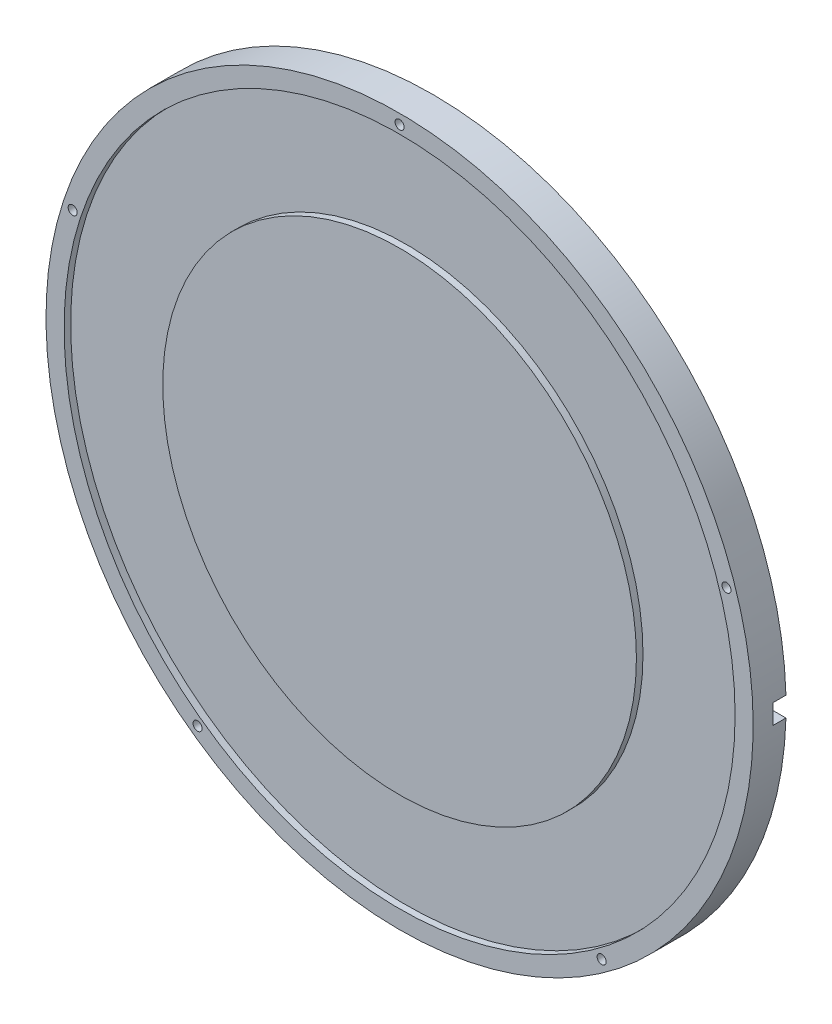
ISO-10303-21;
HEADER;
FILE_DESCRIPTION(('STEP AP214'),'2;1');
FILE_NAME('part.step','',(''),(''),'','','');
FILE_SCHEMA(('AUTOMOTIVE_DESIGN { 1 0 10303 214 1 1 1 1 }'));
ENDSEC;
DATA;
#1=APPLICATION_CONTEXT('core data for automotive mechanical design processes');
#2=APPLICATION_PROTOCOL_DEFINITION('international standard','automotive_design',2000,#1);
#3=PRODUCT_CONTEXT('',#1,'mechanical');
#4=PRODUCT('Part','Part','',(#3));
#5=PRODUCT_RELATED_PRODUCT_CATEGORY('part','',(#4));
#6=PRODUCT_DEFINITION_FORMATION('','',#4);
#7=PRODUCT_DEFINITION_CONTEXT('part definition',#1,'design');
#8=PRODUCT_DEFINITION('design','',#6,#7);
#9=PRODUCT_DEFINITION_SHAPE('','',#8);
#10=(LENGTH_UNIT() NAMED_UNIT(*) SI_UNIT(.MILLI.,.METRE.));
#11=(NAMED_UNIT(*) PLANE_ANGLE_UNIT() SI_UNIT($,.RADIAN.));
#12=(NAMED_UNIT(*) SI_UNIT($,.STERADIAN.) SOLID_ANGLE_UNIT());
#13=UNCERTAINTY_MEASURE_WITH_UNIT(LENGTH_MEASURE(1.E-05),#10,'distance_accuracy_value','');
#14=(GEOMETRIC_REPRESENTATION_CONTEXT(3) GLOBAL_UNCERTAINTY_ASSIGNED_CONTEXT((#13)) GLOBAL_UNIT_ASSIGNED_CONTEXT((#10,
#11,#12)) REPRESENTATION_CONTEXT('',''));
#15=CARTESIAN_POINT('',(0.,0.,0.));
#16=DIRECTION('',(0.,0.,1.));
#17=DIRECTION('',(1.,0.,0.));
#18=AXIS2_PLACEMENT_3D('',#15,#16,#17);
#19=CARTESIAN_POINT('',(0.,0.,0.));
#20=DIRECTION('',(0.,0.,1.));
#21=DIRECTION('',(1.,0.,0.));
#22=AXIS2_PLACEMENT_3D('',#19,#20,#21);
#23=PLANE('',#22);
#24=CARTESIAN_POINT('',(198.770811905687,64.584551824364,0.));
#25=DIRECTION('',(0.,0.,1.));
#26=DIRECTION('',(1.,0.,0.));
#27=AXIS2_PLACEMENT_3D('',#24,#25,#26);
#28=CIRCLE('',#27,5.);
#29=CARTESIAN_POINT('',(203.770811905687,64.584551824364,0.));
#30=VERTEX_POINT('',#29);
#31=EDGE_CURVE('E510',#30,#30,#28,.T.);
#32=ORIENTED_EDGE('',*,*,#31,.T.);
#33=EDGE_LOOP('',(#32));
#34=FACE_BOUND('',#33,.T.);
#35=CARTESIAN_POINT('',(0.,209.,0.));
#36=DIRECTION('',(0.,0.,1.));
#37=DIRECTION('',(1.,0.,0.));
#38=AXIS2_PLACEMENT_3D('',#35,#36,#37);
#39=CIRCLE('',#38,5.);
#40=CARTESIAN_POINT('',(5.00000000000001,209.,0.));
#41=VERTEX_POINT('',#40);
#42=EDGE_CURVE('E512',#41,#41,#39,.T.);
#43=ORIENTED_EDGE('',*,*,#42,.T.);
#44=EDGE_LOOP('',(#43));
#45=FACE_BOUND('',#44,.T.);
#46=CARTESIAN_POINT('',(-198.770811905687,64.584551824364,0.));
#47=DIRECTION('',(0.,0.,1.));
#48=DIRECTION('',(1.,0.,0.));
#49=AXIS2_PLACEMENT_3D('',#46,#47,#48);
#50=CIRCLE('',#49,5.);
#51=CARTESIAN_POINT('',(-193.770811905687,64.584551824364,0.));
#52=VERTEX_POINT('',#51);
#53=EDGE_CURVE('E518',#52,#52,#50,.T.);
#54=ORIENTED_EDGE('',*,*,#53,.T.);
#55=EDGE_LOOP('',(#54));
#56=FACE_BOUND('',#55,.T.);
#57=CARTESIAN_POINT('',(-122.847117729127,-169.084551824364,0.));
#58=DIRECTION('',(0.,0.,1.));
#59=DIRECTION('',(1.,0.,0.));
#60=AXIS2_PLACEMENT_3D('',#57,#58,#59);
#61=CIRCLE('',#60,5.);
#62=CARTESIAN_POINT('',(-117.847117729127,-169.084551824364,0.));
#63=VERTEX_POINT('',#62);
#64=EDGE_CURVE('E524',#63,#63,#61,.T.);
#65=ORIENTED_EDGE('',*,*,#64,.T.);
#66=EDGE_LOOP('',(#65));
#67=FACE_BOUND('',#66,.T.);
#68=CARTESIAN_POINT('',(122.847117729127,-169.084551824364,0.));
#69=DIRECTION('',(0.,0.,1.));
#70=DIRECTION('',(1.,0.,0.));
#71=AXIS2_PLACEMENT_3D('',#68,#69,#70);
#72=CIRCLE('',#71,4.99999999999999);
#73=CARTESIAN_POINT('',(127.847117729127,-169.084551824364,0.));
#74=VERTEX_POINT('',#73);
#75=EDGE_CURVE('E530',#74,#74,#72,.T.);
#76=ORIENTED_EDGE('',*,*,#75,.T.);
#77=EDGE_LOOP('',(#76));
#78=FACE_BOUND('',#77,.T.);
#79=DIRECTION('',(1.,0.,0.));
#80=VECTOR('',#79,1.);
#81=CARTESIAN_POINT('',(160.,-6.,0.));
#82=LINE('',#81,#80);
#83=CARTESIAN_POINT('',(165.,-6.,0.));
#84=VERTEX_POINT('',#83);
#85=CARTESIAN_POINT('',(214.916262762965,-6.,0.));
#86=VERTEX_POINT('',#85);
#87=EDGE_CURVE('E118',#84,#86,#82,.T.);
#88=ORIENTED_EDGE('',*,*,#87,.T.);
#89=CARTESIAN_POINT('',(0.,0.,0.));
#90=DIRECTION('',(0.,0.,1.));
#91=DIRECTION('',(1.,0.,0.));
#92=AXIS2_PLACEMENT_3D('',#89,#90,#91);
#93=CIRCLE('',#92,215.);
#94=CARTESIAN_POINT('',(214.916262762965,6.,0.));
#95=VERTEX_POINT('',#94);
#96=EDGE_CURVE('E48',#95,#86,#93,.T.);
#97=ORIENTED_EDGE('',*,*,#96,.F.);
#98=DIRECTION('',(-1.,0.,0.));
#99=VECTOR('',#98,1.);
#100=CARTESIAN_POINT('',(160.,6.,0.));
#101=LINE('',#100,#99);
#102=CARTESIAN_POINT('',(165.,6.,0.));
#103=VERTEX_POINT('',#102);
#104=EDGE_CURVE('E108',#95,#103,#101,.T.);
#105=ORIENTED_EDGE('',*,*,#104,.T.);
#106=DIRECTION('',(0.,1.,0.));
#107=VECTOR('',#106,1.);
#108=CARTESIAN_POINT('',(165.,-15.,0.));
#109=LINE('',#108,#107);
#110=CARTESIAN_POINT('',(165.,15.,0.));
#111=VERTEX_POINT('',#110);
#112=EDGE_CURVE('E494',#103,#111,#109,.T.);
#113=ORIENTED_EDGE('',*,*,#112,.T.);
#114=DIRECTION('',(-1.,0.,0.));
#115=VECTOR('',#114,1.);
#116=CARTESIAN_POINT('',(125.,15.,0.));
#117=LINE('',#116,#115);
#118=CARTESIAN_POINT('',(125.,15.,0.));
#119=VERTEX_POINT('',#118);
#120=EDGE_CURVE('E481',#111,#119,#117,.T.);
#121=ORIENTED_EDGE('',*,*,#120,.T.);
#122=DIRECTION('',(0.,-1.,0.));
#123=VECTOR('',#122,1.);
#124=CARTESIAN_POINT('',(125.,-15.,0.));
#125=LINE('',#124,#123);
#126=CARTESIAN_POINT('',(125.,-15.,0.));
#127=VERTEX_POINT('',#126);
#128=EDGE_CURVE('E64',#119,#127,#125,.T.);
#129=ORIENTED_EDGE('',*,*,#128,.T.);
#130=DIRECTION('',(1.,0.,0.));
#131=VECTOR('',#130,1.);
#132=CARTESIAN_POINT('',(125.,-15.,0.));
#133=LINE('',#132,#131);
#134=CARTESIAN_POINT('',(165.,-15.,0.));
#135=VERTEX_POINT('',#134);
#136=EDGE_CURVE('E491',#127,#135,#133,.T.);
#137=ORIENTED_EDGE('',*,*,#136,.T.);
#138=EDGE_CURVE('E495',#135,#84,#109,.T.);
#139=ORIENTED_EDGE('',*,*,#138,.T.);
#140=EDGE_LOOP('',(#88,#97,#105,#113,#121,#129,#137,#139));
#141=FACE_BOUND('',#140,.T.);
#142=ADVANCED_FACE('F39',(#34,#45,#56,#67,#78,#141),#23,.F.);
#143=CARTESIAN_POINT('',(0.,0.,20.));
#144=DIRECTION('',(0.,0.,-1.));
#145=DIRECTION('',(-1.,0.,0.));
#146=AXIS2_PLACEMENT_3D('',#143,#144,#145);
#147=CYLINDRICAL_SURFACE('',#146,215.);
#148=CARTESIAN_POINT('',(0.,0.,20.));
#149=DIRECTION('',(0.,0.,1.));
#150=DIRECTION('',(1.,0.,0.));
#151=AXIS2_PLACEMENT_3D('',#148,#149,#150);
#152=CIRCLE('',#151,215.);
#153=CARTESIAN_POINT('',(215.,0.,20.));
#154=VERTEX_POINT('',#153);
#155=EDGE_CURVE('E11',#154,#154,#152,.T.);
#156=ORIENTED_EDGE('',*,*,#155,.F.);
#157=EDGE_LOOP('',(#156));
#158=FACE_BOUND('',#157,.T.);
#159=DIRECTION('',(0.,0.,-1.));
#160=VECTOR('',#159,1.);
#161=CARTESIAN_POINT('',(214.916262762965,-6.,20.));
#162=LINE('',#161,#160);
#163=CARTESIAN_POINT('',(214.916262762965,-6.,8.));
#164=VERTEX_POINT('',#163);
#165=EDGE_CURVE('E471',#164,#86,#162,.T.);
#166=ORIENTED_EDGE('',*,*,#165,.F.);
#167=CARTESIAN_POINT('',(0.,0.,8.));
#168=DIRECTION('',(0.,0.,-1.));
#169=DIRECTION('',(-1.,0.,0.));
#170=AXIS2_PLACEMENT_3D('',#167,#168,#169);
#171=CIRCLE('',#170,215.);
#172=CARTESIAN_POINT('',(214.916262762965,6.,8.));
#173=VERTEX_POINT('',#172);
#174=EDGE_CURVE('E124',#173,#164,#171,.T.);
#175=ORIENTED_EDGE('',*,*,#174,.F.);
#176=DIRECTION('',(0.,0.,-1.));
#177=VECTOR('',#176,1.);
#178=CARTESIAN_POINT('',(214.916262762965,6.,20.));
#179=LINE('',#178,#177);
#180=EDGE_CURVE('E111',#95,#173,#179,.F.);
#181=ORIENTED_EDGE('',*,*,#180,.F.);
#182=ORIENTED_EDGE('',*,*,#96,.T.);
#183=EDGE_LOOP('',(#166,#175,#181,#182));
#184=FACE_BOUND('',#183,.T.);
#185=ADVANCED_FACE('F41',(#158,#184),#147,.T.);
#186=CARTESIAN_POINT('',(165.,-15.,8.));
#187=DIRECTION('',(-1.,0.,0.));
#188=DIRECTION('',(0.,0.,1.));
#189=AXIS2_PLACEMENT_3D('',#186,#187,#188);
#190=PLANE('',#189);
#191=DIRECTION('',(0.,1.,0.));
#192=VECTOR('',#191,1.);
#193=CARTESIAN_POINT('',(165.,-15.,8.));
#194=LINE('',#193,#192);
#195=CARTESIAN_POINT('',(165.,-15.,8.));
#196=VERTEX_POINT('',#195);
#197=CARTESIAN_POINT('',(165.,-6.,8.));
#198=VERTEX_POINT('',#197);
#199=EDGE_CURVE('E484',#196,#198,#194,.T.);
#200=ORIENTED_EDGE('',*,*,#199,.T.);
#201=DIRECTION('',(0.,0.,-1.));
#202=VECTOR('',#201,1.);
#203=CARTESIAN_POINT('',(165.,-6.,8.));
#204=LINE('',#203,#202);
#205=EDGE_CURVE('E125',#198,#84,#204,.T.);
#206=ORIENTED_EDGE('',*,*,#205,.T.);
#207=ORIENTED_EDGE('',*,*,#138,.F.);
#208=DIRECTION('',(0.,0.,-1.));
#209=VECTOR('',#208,1.);
#210=CARTESIAN_POINT('',(165.,-15.,8.));
#211=LINE('',#210,#209);
#212=EDGE_CURVE('E503',#196,#135,#211,.T.);
#213=ORIENTED_EDGE('',*,*,#212,.F.);
#214=EDGE_LOOP('',(#200,#206,#207,#213));
#215=FACE_BOUND('',#214,.T.);
#216=ADVANCED_FACE('F196',(#215),#190,.T.);
#217=ORIENTED_EDGE('',*,*,#112,.F.);
#218=DIRECTION('',(0.,0.,1.));
#219=VECTOR('',#218,1.);
#220=CARTESIAN_POINT('',(165.,6.,8.));
#221=LINE('',#220,#219);
#222=CARTESIAN_POINT('',(165.,6.,8.));
#223=VERTEX_POINT('',#222);
#224=EDGE_CURVE('E114',#103,#223,#221,.T.);
#225=ORIENTED_EDGE('',*,*,#224,.T.);
#226=CARTESIAN_POINT('',(165.,15.,8.));
#227=VERTEX_POINT('',#226);
#228=EDGE_CURVE('E483',#223,#227,#194,.T.);
#229=ORIENTED_EDGE('',*,*,#228,.T.);
#230=DIRECTION('',(0.,0.,-1.));
#231=VECTOR('',#230,1.);
#232=CARTESIAN_POINT('',(165.,15.,8.));
#233=LINE('',#232,#231);
#234=EDGE_CURVE('E500',#227,#111,#233,.T.);
#235=ORIENTED_EDGE('',*,*,#234,.T.);
#236=EDGE_LOOP('',(#217,#225,#229,#235));
#237=FACE_BOUND('',#236,.T.);
#238=ADVANCED_FACE('F201',(#237),#190,.T.);
#239=CARTESIAN_POINT('',(0.,0.,20.));
#240=DIRECTION('',(0.,0.,1.));
#241=DIRECTION('',(1.,0.,0.));
#242=AXIS2_PLACEMENT_3D('',#239,#240,#241);
#243=PLANE('',#242);
#244=CARTESIAN_POINT('',(198.770811905687,64.584551824364,20.));
#245=DIRECTION('',(0.,0.,1.));
#246=DIRECTION('',(1.,0.,0.));
#247=AXIS2_PLACEMENT_3D('',#244,#245,#246);
#248=CIRCLE('',#247,2.75);
#249=CARTESIAN_POINT('',(201.520811905687,64.584551824364,20.));
#250=VERTEX_POINT('',#249);
#251=EDGE_CURVE('E168',#250,#250,#248,.T.);
#252=ORIENTED_EDGE('',*,*,#251,.F.);
#253=EDGE_LOOP('',(#252));
#254=FACE_BOUND('',#253,.T.);
#255=CARTESIAN_POINT('',(0.,209.,20.));
#256=DIRECTION('',(0.,0.,1.));
#257=DIRECTION('',(1.,0.,0.));
#258=AXIS2_PLACEMENT_3D('',#255,#256,#257);
#259=CIRCLE('',#258,2.75);
#260=CARTESIAN_POINT('',(2.75000000000001,209.,20.));
#261=VERTEX_POINT('',#260);
#262=EDGE_CURVE('E537',#261,#261,#259,.T.);
#263=ORIENTED_EDGE('',*,*,#262,.F.);
#264=EDGE_LOOP('',(#263));
#265=FACE_BOUND('',#264,.T.);
#266=CARTESIAN_POINT('',(-198.770811905687,64.584551824364,20.));
#267=DIRECTION('',(0.,0.,1.));
#268=DIRECTION('',(1.,0.,0.));
#269=AXIS2_PLACEMENT_3D('',#266,#267,#268);
#270=CIRCLE('',#269,2.75);
#271=CARTESIAN_POINT('',(-196.020811905687,64.584551824364,20.));
#272=VERTEX_POINT('',#271);
#273=EDGE_CURVE('E159',#272,#272,#270,.T.);
#274=ORIENTED_EDGE('',*,*,#273,.F.);
#275=EDGE_LOOP('',(#274));
#276=FACE_BOUND('',#275,.T.);
#277=CARTESIAN_POINT('',(-122.847117729127,-169.084551824364,20.));
#278=DIRECTION('',(0.,0.,1.));
#279=DIRECTION('',(1.,0.,0.));
#280=AXIS2_PLACEMENT_3D('',#277,#278,#279);
#281=CIRCLE('',#280,2.75);
#282=CARTESIAN_POINT('',(-120.097117729127,-169.084551824364,20.));
#283=VERTEX_POINT('',#282);
#284=EDGE_CURVE('E154',#283,#283,#281,.T.);
#285=ORIENTED_EDGE('',*,*,#284,.F.);
#286=EDGE_LOOP('',(#285));
#287=FACE_BOUND('',#286,.T.);
#288=CARTESIAN_POINT('',(122.847117729127,-169.084551824364,20.));
#289=DIRECTION('',(0.,0.,1.));
#290=DIRECTION('',(1.,0.,0.));
#291=AXIS2_PLACEMENT_3D('',#288,#289,#290);
#292=CIRCLE('',#291,2.74999999999999);
#293=CARTESIAN_POINT('',(125.597117729127,-169.084551824364,20.));
#294=VERTEX_POINT('',#293);
#295=EDGE_CURVE('E150',#294,#294,#292,.T.);
#296=ORIENTED_EDGE('',*,*,#295,.F.);
#297=EDGE_LOOP('',(#296));
#298=FACE_BOUND('',#297,.T.);
#299=CARTESIAN_POINT('',(0.,0.,20.));
#300=DIRECTION('',(0.,0.,1.));
#301=DIRECTION('',(1.,0.,0.));
#302=AXIS2_PLACEMENT_3D('',#299,#300,#301);
#303=CIRCLE('',#302,204.);
#304=CARTESIAN_POINT('',(204.,0.,20.));
#305=VERTEX_POINT('',#304);
#306=EDGE_CURVE('E129',#305,#305,#303,.T.);
#307=ORIENTED_EDGE('',*,*,#306,.F.);
#308=EDGE_LOOP('',(#307));
#309=FACE_BOUND('',#308,.T.);
#310=ORIENTED_EDGE('',*,*,#155,.T.);
#311=EDGE_LOOP('',(#310));
#312=FACE_BOUND('',#311,.T.);
#313=ADVANCED_FACE('F187',(#254,#265,#276,#287,#298,#309,#312),#243,.T.);
#314=CARTESIAN_POINT('',(0.,0.,16.));
#315=DIRECTION('',(0.,0.,1.));
#316=DIRECTION('',(1.,0.,0.));
#317=AXIS2_PLACEMENT_3D('',#314,#315,#316);
#318=PLANE('',#317);
#319=CARTESIAN_POINT('',(0.,0.,16.));
#320=DIRECTION('',(0.,0.,1.));
#321=DIRECTION('',(1.,0.,0.));
#322=AXIS2_PLACEMENT_3D('',#319,#320,#321);
#323=CIRCLE('',#322,204.);
#324=CARTESIAN_POINT('',(204.,0.,16.));
#325=VERTEX_POINT('',#324);
#326=EDGE_CURVE('E132',#325,#325,#323,.T.);
#327=ORIENTED_EDGE('',*,*,#326,.T.);
#328=EDGE_LOOP('',(#327));
#329=FACE_BOUND('',#328,.T.);
#330=CARTESIAN_POINT('',(0.,0.,16.));
#331=DIRECTION('',(0.,0.,1.));
#332=DIRECTION('',(1.,0.,0.));
#333=AXIS2_PLACEMENT_3D('',#330,#331,#332);
#334=CIRCLE('',#333,144.);
#335=CARTESIAN_POINT('',(144.,0.,16.));
#336=VERTEX_POINT('',#335);
#337=EDGE_CURVE('E166',#336,#336,#334,.T.);
#338=ORIENTED_EDGE('',*,*,#337,.F.);
#339=EDGE_LOOP('',(#338));
#340=FACE_BOUND('',#339,.T.);
#341=ADVANCED_FACE('F172',(#329,#340),#318,.T.);
#342=CARTESIAN_POINT('',(0.,0.,20.));
#343=DIRECTION('',(0.,0.,-1.));
#344=DIRECTION('',(-1.,0.,0.));
#345=AXIS2_PLACEMENT_3D('',#342,#343,#344);
#346=CYLINDRICAL_SURFACE('',#345,204.);
#347=ORIENTED_EDGE('',*,*,#306,.T.);
#348=EDGE_LOOP('',(#347));
#349=FACE_BOUND('',#348,.T.);
#350=ORIENTED_EDGE('',*,*,#326,.F.);
#351=EDGE_LOOP('',(#350));
#352=FACE_BOUND('',#351,.T.);
#353=ADVANCED_FACE('F175',(#349,#352),#346,.F.);
#354=CARTESIAN_POINT('',(0.,0.,20.));
#355=DIRECTION('',(0.,0.,-1.));
#356=DIRECTION('',(-1.,0.,0.));
#357=AXIS2_PLACEMENT_3D('',#354,#355,#356);
#358=CYLINDRICAL_SURFACE('',#357,144.);
#359=CARTESIAN_POINT('',(0.,0.,20.));
#360=DIRECTION('',(0.,0.,1.));
#361=DIRECTION('',(1.,0.,0.));
#362=AXIS2_PLACEMENT_3D('',#359,#360,#361);
#363=CIRCLE('',#362,144.);
#364=CARTESIAN_POINT('',(144.,0.,20.));
#365=VERTEX_POINT('',#364);
#366=EDGE_CURVE('E163',#365,#365,#363,.T.);
#367=ORIENTED_EDGE('',*,*,#366,.F.);
#368=EDGE_LOOP('',(#367));
#369=FACE_BOUND('',#368,.T.);
#370=ORIENTED_EDGE('',*,*,#337,.T.);
#371=EDGE_LOOP('',(#370));
#372=FACE_BOUND('',#371,.T.);
#373=ADVANCED_FACE('F177',(#369,#372),#358,.T.);
#374=ORIENTED_EDGE('',*,*,#366,.T.);
#375=EDGE_LOOP('',(#374));
#376=FACE_BOUND('',#375,.T.);
#377=ADVANCED_FACE('F184',(#376),#243,.T.);
#378=CARTESIAN_POINT('',(122.847117729127,-169.084551824364,20.));
#379=DIRECTION('',(0.,0.,-1.));
#380=DIRECTION('',(-1.,0.,0.));
#381=AXIS2_PLACEMENT_3D('',#378,#379,#380);
#382=CYLINDRICAL_SURFACE('',#381,2.74999999999999);
#383=CARTESIAN_POINT('',(122.847117729127,-169.084551824364,6.));
#384=DIRECTION('',(0.,0.,1.));
#385=DIRECTION('',(1.,0.,0.));
#386=AXIS2_PLACEMENT_3D('',#383,#384,#385);
#387=CIRCLE('',#386,2.74999999999999);
#388=CARTESIAN_POINT('',(125.597117729127,-169.084551824364,6.));
#389=VERTEX_POINT('',#388);
#390=EDGE_CURVE('E43',#389,#389,#387,.T.);
#391=ORIENTED_EDGE('',*,*,#390,.F.);
#392=EDGE_LOOP('',(#391));
#393=FACE_BOUND('',#392,.T.);
#394=ORIENTED_EDGE('',*,*,#295,.T.);
#395=EDGE_LOOP('',(#394));
#396=FACE_BOUND('',#395,.T.);
#397=ADVANCED_FACE('F212',(#393,#396),#382,.F.);
#398=CARTESIAN_POINT('',(-122.847117729127,-169.084551824364,20.));
#399=DIRECTION('',(0.,0.,-1.));
#400=DIRECTION('',(-1.,0.,0.));
#401=AXIS2_PLACEMENT_3D('',#398,#399,#400);
#402=CYLINDRICAL_SURFACE('',#401,2.75);
#403=CARTESIAN_POINT('',(-122.847117729127,-169.084551824364,6.));
#404=DIRECTION('',(0.,0.,1.));
#405=DIRECTION('',(1.,0.,0.));
#406=AXIS2_PLACEMENT_3D('',#403,#404,#405);
#407=CIRCLE('',#406,2.75);
#408=CARTESIAN_POINT('',(-120.097117729127,-169.084551824364,6.));
#409=VERTEX_POINT('',#408);
#410=EDGE_CURVE('E145',#409,#409,#407,.T.);
#411=ORIENTED_EDGE('',*,*,#410,.F.);
#412=EDGE_LOOP('',(#411));
#413=FACE_BOUND('',#412,.T.);
#414=ORIENTED_EDGE('',*,*,#284,.T.);
#415=EDGE_LOOP('',(#414));
#416=FACE_BOUND('',#415,.T.);
#417=ADVANCED_FACE('F216',(#413,#416),#402,.F.);
#418=CARTESIAN_POINT('',(-198.770811905687,64.584551824364,20.));
#419=DIRECTION('',(0.,0.,-1.));
#420=DIRECTION('',(-1.,0.,0.));
#421=AXIS2_PLACEMENT_3D('',#418,#419,#420);
#422=CYLINDRICAL_SURFACE('',#421,2.75);
#423=CARTESIAN_POINT('',(-198.770811905687,64.584551824364,6.));
#424=DIRECTION('',(0.,0.,1.));
#425=DIRECTION('',(1.,0.,0.));
#426=AXIS2_PLACEMENT_3D('',#423,#424,#425);
#427=CIRCLE('',#426,2.75);
#428=CARTESIAN_POINT('',(-196.020811905687,64.584551824364,6.));
#429=VERTEX_POINT('',#428);
#430=EDGE_CURVE('E143',#429,#429,#427,.T.);
#431=ORIENTED_EDGE('',*,*,#430,.F.);
#432=EDGE_LOOP('',(#431));
#433=FACE_BOUND('',#432,.T.);
#434=ORIENTED_EDGE('',*,*,#273,.T.);
#435=EDGE_LOOP('',(#434));
#436=FACE_BOUND('',#435,.T.);
#437=ADVANCED_FACE('F225',(#433,#436),#422,.F.);
#438=CARTESIAN_POINT('',(0.,209.,20.));
#439=DIRECTION('',(0.,0.,-1.));
#440=DIRECTION('',(-1.,0.,0.));
#441=AXIS2_PLACEMENT_3D('',#438,#439,#440);
#442=CYLINDRICAL_SURFACE('',#441,2.75);
#443=CARTESIAN_POINT('',(0.,209.,6.));
#444=DIRECTION('',(0.,0.,1.));
#445=DIRECTION('',(1.,0.,0.));
#446=AXIS2_PLACEMENT_3D('',#443,#444,#445);
#447=CIRCLE('',#446,2.75);
#448=CARTESIAN_POINT('',(2.75000000000001,209.,6.));
#449=VERTEX_POINT('',#448);
#450=EDGE_CURVE('E139',#449,#449,#447,.T.);
#451=ORIENTED_EDGE('',*,*,#450,.F.);
#452=EDGE_LOOP('',(#451));
#453=FACE_BOUND('',#452,.T.);
#454=ORIENTED_EDGE('',*,*,#262,.T.);
#455=EDGE_LOOP('',(#454));
#456=FACE_BOUND('',#455,.T.);
#457=ADVANCED_FACE('F231',(#453,#456),#442,.F.);
#458=CARTESIAN_POINT('',(198.770811905687,64.584551824364,20.));
#459=DIRECTION('',(0.,0.,-1.));
#460=DIRECTION('',(-1.,0.,0.));
#461=AXIS2_PLACEMENT_3D('',#458,#459,#460);
#462=CYLINDRICAL_SURFACE('',#461,2.75);
#463=CARTESIAN_POINT('',(198.770811905687,64.584551824364,6.));
#464=DIRECTION('',(0.,0.,1.));
#465=DIRECTION('',(1.,0.,0.));
#466=AXIS2_PLACEMENT_3D('',#463,#464,#465);
#467=CIRCLE('',#466,2.75);
#468=CARTESIAN_POINT('',(201.520811905687,64.584551824364,6.));
#469=VERTEX_POINT('',#468);
#470=EDGE_CURVE('E136',#469,#469,#467,.T.);
#471=ORIENTED_EDGE('',*,*,#470,.F.);
#472=EDGE_LOOP('',(#471));
#473=FACE_BOUND('',#472,.T.);
#474=ORIENTED_EDGE('',*,*,#251,.T.);
#475=EDGE_LOOP('',(#474));
#476=FACE_BOUND('',#475,.T.);
#477=ADVANCED_FACE('F235',(#473,#476),#462,.F.);
#478=CARTESIAN_POINT('',(198.770811905687,64.584551824364,6.));
#479=DIRECTION('',(0.,0.,-1.));
#480=DIRECTION('',(-1.,0.,0.));
#481=AXIS2_PLACEMENT_3D('',#478,#479,#480);
#482=CYLINDRICAL_SURFACE('',#481,5.);
#483=CARTESIAN_POINT('',(198.770811905687,64.584551824364,6.));
#484=DIRECTION('',(0.,0.,1.));
#485=DIRECTION('',(1.,0.,0.));
#486=AXIS2_PLACEMENT_3D('',#483,#484,#485);
#487=CIRCLE('',#486,5.);
#488=CARTESIAN_POINT('',(203.770811905687,64.584551824364,6.));
#489=VERTEX_POINT('',#488);
#490=EDGE_CURVE('E140',#489,#489,#487,.T.);
#491=ORIENTED_EDGE('',*,*,#490,.T.);
#492=EDGE_LOOP('',(#491));
#493=FACE_BOUND('',#492,.T.);
#494=ORIENTED_EDGE('',*,*,#31,.F.);
#495=EDGE_LOOP('',(#494));
#496=FACE_BOUND('',#495,.T.);
#497=ADVANCED_FACE('F239',(#493,#496),#482,.F.);
#498=CARTESIAN_POINT('',(198.770811905687,64.584551824364,6.));
#499=DIRECTION('',(0.,0.,1.));
#500=DIRECTION('',(1.,0.,0.));
#501=AXIS2_PLACEMENT_3D('',#498,#499,#500);
#502=PLANE('',#501);
#503=ORIENTED_EDGE('',*,*,#470,.T.);
#504=EDGE_LOOP('',(#503));
#505=FACE_BOUND('',#504,.T.);
#506=ORIENTED_EDGE('',*,*,#490,.F.);
#507=EDGE_LOOP('',(#506));
#508=FACE_BOUND('',#507,.T.);
#509=ADVANCED_FACE('F271',(#505,#508),#502,.F.);
#510=CARTESIAN_POINT('',(0.,209.,6.));
#511=DIRECTION('',(0.,0.,-1.));
#512=DIRECTION('',(-1.,0.,0.));
#513=AXIS2_PLACEMENT_3D('',#510,#511,#512);
#514=CYLINDRICAL_SURFACE('',#513,5.);
#515=CARTESIAN_POINT('',(0.,209.,6.));
#516=DIRECTION('',(0.,0.,1.));
#517=DIRECTION('',(1.,0.,0.));
#518=AXIS2_PLACEMENT_3D('',#515,#516,#517);
#519=CIRCLE('',#518,5.);
#520=CARTESIAN_POINT('',(5.00000000000001,209.,6.));
#521=VERTEX_POINT('',#520);
#522=EDGE_CURVE('E515',#521,#521,#519,.T.);
#523=ORIENTED_EDGE('',*,*,#522,.T.);
#524=EDGE_LOOP('',(#523));
#525=FACE_BOUND('',#524,.T.);
#526=ORIENTED_EDGE('',*,*,#42,.F.);
#527=EDGE_LOOP('',(#526));
#528=FACE_BOUND('',#527,.T.);
#529=ADVANCED_FACE('F267',(#525,#528),#514,.F.);
#530=CARTESIAN_POINT('',(0.,209.,6.));
#531=DIRECTION('',(0.,0.,1.));
#532=DIRECTION('',(1.,0.,0.));
#533=AXIS2_PLACEMENT_3D('',#530,#531,#532);
#534=PLANE('',#533);
#535=ORIENTED_EDGE('',*,*,#450,.T.);
#536=EDGE_LOOP('',(#535));
#537=FACE_BOUND('',#536,.T.);
#538=ORIENTED_EDGE('',*,*,#522,.F.);
#539=EDGE_LOOP('',(#538));
#540=FACE_BOUND('',#539,.T.);
#541=ADVANCED_FACE('F263',(#537,#540),#534,.F.);
#542=CARTESIAN_POINT('',(-198.770811905687,64.584551824364,6.));
#543=DIRECTION('',(0.,0.,-1.));
#544=DIRECTION('',(-1.,0.,0.));
#545=AXIS2_PLACEMENT_3D('',#542,#543,#544);
#546=CYLINDRICAL_SURFACE('',#545,5.);
#547=CARTESIAN_POINT('',(-198.770811905687,64.584551824364,6.));
#548=DIRECTION('',(0.,0.,1.));
#549=DIRECTION('',(1.,0.,0.));
#550=AXIS2_PLACEMENT_3D('',#547,#548,#549);
#551=CIRCLE('',#550,5.);
#552=CARTESIAN_POINT('',(-193.770811905687,64.584551824364,6.));
#553=VERTEX_POINT('',#552);
#554=EDGE_CURVE('E521',#553,#553,#551,.T.);
#555=ORIENTED_EDGE('',*,*,#554,.T.);
#556=EDGE_LOOP('',(#555));
#557=FACE_BOUND('',#556,.T.);
#558=ORIENTED_EDGE('',*,*,#53,.F.);
#559=EDGE_LOOP('',(#558));
#560=FACE_BOUND('',#559,.T.);
#561=ADVANCED_FACE('F259',(#557,#560),#546,.F.);
#562=CARTESIAN_POINT('',(-198.770811905687,64.584551824364,6.));
#563=DIRECTION('',(0.,0.,1.));
#564=DIRECTION('',(1.,0.,0.));
#565=AXIS2_PLACEMENT_3D('',#562,#563,#564);
#566=PLANE('',#565);
#567=ORIENTED_EDGE('',*,*,#430,.T.);
#568=EDGE_LOOP('',(#567));
#569=FACE_BOUND('',#568,.T.);
#570=ORIENTED_EDGE('',*,*,#554,.F.);
#571=EDGE_LOOP('',(#570));
#572=FACE_BOUND('',#571,.T.);
#573=ADVANCED_FACE('F255',(#569,#572),#566,.F.);
#574=CARTESIAN_POINT('',(-122.847117729127,-169.084551824364,6.));
#575=DIRECTION('',(0.,0.,-1.));
#576=DIRECTION('',(-1.,0.,0.));
#577=AXIS2_PLACEMENT_3D('',#574,#575,#576);
#578=CYLINDRICAL_SURFACE('',#577,5.);
#579=CARTESIAN_POINT('',(-122.847117729127,-169.084551824364,6.));
#580=DIRECTION('',(0.,0.,1.));
#581=DIRECTION('',(1.,0.,0.));
#582=AXIS2_PLACEMENT_3D('',#579,#580,#581);
#583=CIRCLE('',#582,5.);
#584=CARTESIAN_POINT('',(-117.847117729127,-169.084551824364,6.));
#585=VERTEX_POINT('',#584);
#586=EDGE_CURVE('E527',#585,#585,#583,.T.);
#587=ORIENTED_EDGE('',*,*,#586,.T.);
#588=EDGE_LOOP('',(#587));
#589=FACE_BOUND('',#588,.T.);
#590=ORIENTED_EDGE('',*,*,#64,.F.);
#591=EDGE_LOOP('',(#590));
#592=FACE_BOUND('',#591,.T.);
#593=ADVANCED_FACE('F252',(#589,#592),#578,.F.);
#594=CARTESIAN_POINT('',(-122.847117729127,-169.084551824364,6.));
#595=DIRECTION('',(0.,0.,1.));
#596=DIRECTION('',(1.,0.,0.));
#597=AXIS2_PLACEMENT_3D('',#594,#595,#596);
#598=PLANE('',#597);
#599=ORIENTED_EDGE('',*,*,#410,.T.);
#600=EDGE_LOOP('',(#599));
#601=FACE_BOUND('',#600,.T.);
#602=ORIENTED_EDGE('',*,*,#586,.F.);
#603=EDGE_LOOP('',(#602));
#604=FACE_BOUND('',#603,.T.);
#605=ADVANCED_FACE('F248',(#601,#604),#598,.F.);
#606=CARTESIAN_POINT('',(122.847117729127,-169.084551824364,6.));
#607=DIRECTION('',(0.,0.,-1.));
#608=DIRECTION('',(-1.,0.,0.));
#609=AXIS2_PLACEMENT_3D('',#606,#607,#608);
#610=CYLINDRICAL_SURFACE('',#609,4.99999999999999);
#611=CARTESIAN_POINT('',(122.847117729127,-169.084551824364,6.));
#612=DIRECTION('',(0.,0.,1.));
#613=DIRECTION('',(1.,0.,0.));
#614=AXIS2_PLACEMENT_3D('',#611,#612,#613);
#615=CIRCLE('',#614,4.99999999999999);
#616=CARTESIAN_POINT('',(127.847117729127,-169.084551824364,6.));
#617=VERTEX_POINT('',#616);
#618=EDGE_CURVE('E507',#617,#617,#615,.T.);
#619=ORIENTED_EDGE('',*,*,#618,.T.);
#620=EDGE_LOOP('',(#619));
#621=FACE_BOUND('',#620,.T.);
#622=ORIENTED_EDGE('',*,*,#75,.F.);
#623=EDGE_LOOP('',(#622));
#624=FACE_BOUND('',#623,.T.);
#625=ADVANCED_FACE('F245',(#621,#624),#610,.F.);
#626=CARTESIAN_POINT('',(122.847117729127,-169.084551824364,6.));
#627=DIRECTION('',(0.,0.,1.));
#628=DIRECTION('',(1.,0.,0.));
#629=AXIS2_PLACEMENT_3D('',#626,#627,#628);
#630=PLANE('',#629);
#631=ORIENTED_EDGE('',*,*,#390,.T.);
#632=EDGE_LOOP('',(#631));
#633=FACE_BOUND('',#632,.T.);
#634=ORIENTED_EDGE('',*,*,#618,.F.);
#635=EDGE_LOOP('',(#634));
#636=FACE_BOUND('',#635,.T.);
#637=ADVANCED_FACE('F241',(#633,#636),#630,.F.);
#638=CARTESIAN_POINT('',(125.,-15.,8.));
#639=DIRECTION('',(1.,0.,0.));
#640=DIRECTION('',(0.,0.,-1.));
#641=AXIS2_PLACEMENT_3D('',#638,#639,#640);
#642=PLANE('',#641);
#643=ORIENTED_EDGE('',*,*,#128,.F.);
#644=DIRECTION('',(0.,0.,-1.));
#645=VECTOR('',#644,1.);
#646=CARTESIAN_POINT('',(125.,15.,8.));
#647=LINE('',#646,#645);
#648=CARTESIAN_POINT('',(125.,15.,8.));
#649=VERTEX_POINT('',#648);
#650=EDGE_CURVE('E489',#649,#119,#647,.T.);
#651=ORIENTED_EDGE('',*,*,#650,.F.);
#652=DIRECTION('',(0.,-1.,0.));
#653=VECTOR('',#652,1.);
#654=CARTESIAN_POINT('',(125.,-15.,8.));
#655=LINE('',#654,#653);
#656=CARTESIAN_POINT('',(125.,-15.,8.));
#657=VERTEX_POINT('',#656);
#658=EDGE_CURVE('E477',#649,#657,#655,.T.);
#659=ORIENTED_EDGE('',*,*,#658,.T.);
#660=DIRECTION('',(0.,0.,-1.));
#661=VECTOR('',#660,1.);
#662=CARTESIAN_POINT('',(125.,-15.,8.));
#663=LINE('',#662,#661);
#664=EDGE_CURVE('E505',#657,#127,#663,.T.);
#665=ORIENTED_EDGE('',*,*,#664,.T.);
#666=EDGE_LOOP('',(#643,#651,#659,#665));
#667=FACE_BOUND('',#666,.T.);
#668=ADVANCED_FACE('F244',(#667),#642,.T.);
#669=CARTESIAN_POINT('',(125.,-15.,8.));
#670=DIRECTION('',(0.,1.,0.));
#671=DIRECTION('',(0.,0.,1.));
#672=AXIS2_PLACEMENT_3D('',#669,#670,#671);
#673=PLANE('',#672);
#674=ORIENTED_EDGE('',*,*,#136,.F.);
#675=ORIENTED_EDGE('',*,*,#664,.F.);
#676=DIRECTION('',(1.,0.,0.));
#677=VECTOR('',#676,1.);
#678=CARTESIAN_POINT('',(125.,-15.,8.));
#679=LINE('',#678,#677);
#680=EDGE_CURVE('E480',#657,#196,#679,.T.);
#681=ORIENTED_EDGE('',*,*,#680,.T.);
#682=ORIENTED_EDGE('',*,*,#212,.T.);
#683=EDGE_LOOP('',(#674,#675,#681,#682));
#684=FACE_BOUND('',#683,.T.);
#685=ADVANCED_FACE('F281',(#684),#673,.T.);
#686=CARTESIAN_POINT('',(125.,15.,8.));
#687=DIRECTION('',(0.,-1.,0.));
#688=DIRECTION('',(0.,0.,-1.));
#689=AXIS2_PLACEMENT_3D('',#686,#687,#688);
#690=PLANE('',#689);
#691=ORIENTED_EDGE('',*,*,#120,.F.);
#692=ORIENTED_EDGE('',*,*,#234,.F.);
#693=DIRECTION('',(-1.,0.,0.));
#694=VECTOR('',#693,1.);
#695=CARTESIAN_POINT('',(125.,15.,8.));
#696=LINE('',#695,#694);
#697=EDGE_CURVE('E487',#227,#649,#696,.T.);
#698=ORIENTED_EDGE('',*,*,#697,.T.);
#699=ORIENTED_EDGE('',*,*,#650,.T.);
#700=EDGE_LOOP('',(#691,#692,#698,#699));
#701=FACE_BOUND('',#700,.T.);
#702=ADVANCED_FACE('F283',(#701),#690,.T.);
#703=CARTESIAN_POINT('',(0.,0.,8.));
#704=DIRECTION('',(0.,0.,-1.));
#705=DIRECTION('',(-1.,0.,0.));
#706=AXIS2_PLACEMENT_3D('',#703,#704,#705);
#707=PLANE('',#706);
#708=ORIENTED_EDGE('',*,*,#228,.F.);
#709=DIRECTION('',(-1.,0.,0.));
#710=VECTOR('',#709,1.);
#711=CARTESIAN_POINT('',(160.,6.,8.));
#712=LINE('',#711,#710);
#713=EDGE_CURVE('E585',#173,#223,#712,.T.);
#714=ORIENTED_EDGE('',*,*,#713,.F.);
#715=ORIENTED_EDGE('',*,*,#174,.T.);
#716=DIRECTION('',(1.,0.,0.));
#717=VECTOR('',#716,1.);
#718=CARTESIAN_POINT('',(160.,-6.,8.));
#719=LINE('',#718,#717);
#720=EDGE_CURVE('E56',#198,#164,#719,.T.);
#721=ORIENTED_EDGE('',*,*,#720,.F.);
#722=ORIENTED_EDGE('',*,*,#199,.F.);
#723=ORIENTED_EDGE('',*,*,#680,.F.);
#724=ORIENTED_EDGE('',*,*,#658,.F.);
#725=ORIENTED_EDGE('',*,*,#697,.F.);
#726=EDGE_LOOP('',(#708,#714,#715,#721,#722,#723,#724,#725));
#727=FACE_BOUND('',#726,.T.);
#728=ADVANCED_FACE('F289',(#727),#707,.T.);
#729=CARTESIAN_POINT('',(160.,-6.,8.));
#730=DIRECTION('',(0.,1.,0.));
#731=DIRECTION('',(0.,0.,1.));
#732=AXIS2_PLACEMENT_3D('',#729,#730,#731);
#733=PLANE('',#732);
#734=ORIENTED_EDGE('',*,*,#165,.T.);
#735=ORIENTED_EDGE('',*,*,#87,.F.);
#736=ORIENTED_EDGE('',*,*,#205,.F.);
#737=ORIENTED_EDGE('',*,*,#720,.T.);
#738=EDGE_LOOP('',(#734,#735,#736,#737));
#739=FACE_BOUND('',#738,.T.);
#740=ADVANCED_FACE('F293',(#739),#733,.T.);
#741=CARTESIAN_POINT('',(160.,6.,8.));
#742=DIRECTION('',(0.,-1.,0.));
#743=DIRECTION('',(0.,0.,-1.));
#744=AXIS2_PLACEMENT_3D('',#741,#742,#743);
#745=PLANE('',#744);
#746=ORIENTED_EDGE('',*,*,#180,.T.);
#747=ORIENTED_EDGE('',*,*,#713,.T.);
#748=ORIENTED_EDGE('',*,*,#224,.F.);
#749=ORIENTED_EDGE('',*,*,#104,.F.);
#750=EDGE_LOOP('',(#746,#747,#748,#749));
#751=FACE_BOUND('',#750,.T.);
#752=ADVANCED_FACE('F110',(#751),#745,.T.);
#753=CLOSED_SHELL('',(#142,#185,#216,#238,#313,#341,#353,#373,#377,#397,#417,#437,#457,#477,
#497,#509,#529,#541,#561,#573,#593,#605,#625,#637,#668,#685,#702,#728,#740,#752));
#754=MANIFOLD_SOLID_BREP('B2',#753);
#755=ADVANCED_BREP_SHAPE_REPRESENTATION('',(#18,#754),#14);
#756=SHAPE_DEFINITION_REPRESENTATION(#9,#755);
ENDSEC;
END-ISO-10303-21;
